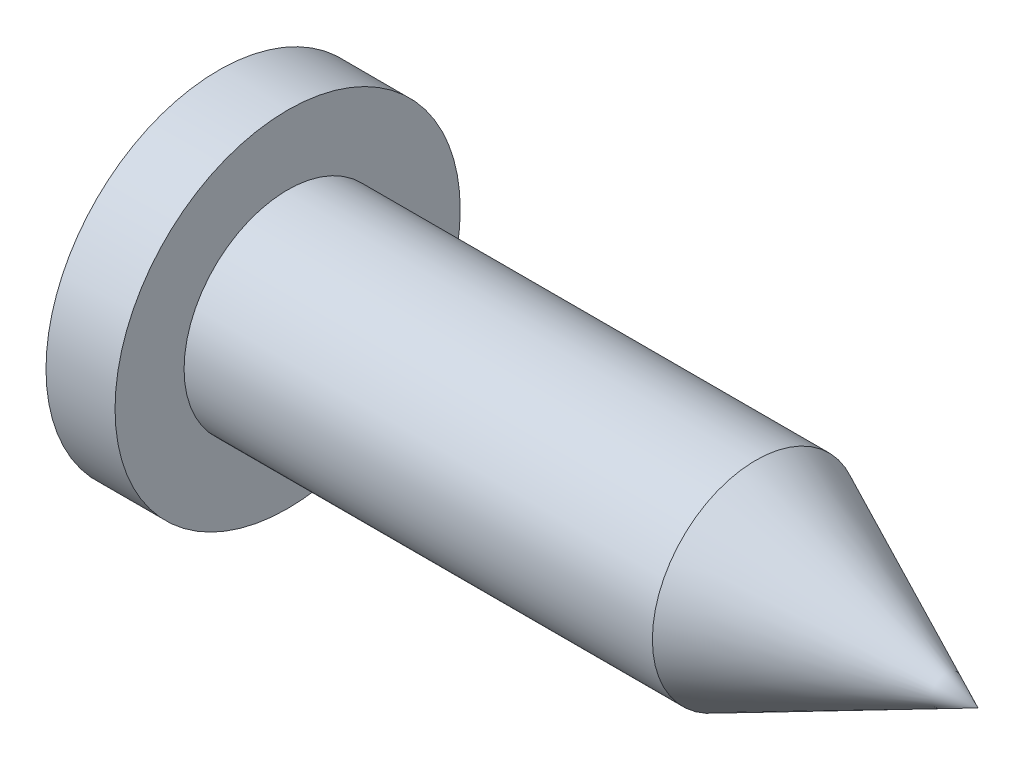
ISO-10303-21;
HEADER;
FILE_DESCRIPTION(('STEP AP214'),'2;1');
FILE_NAME('part.step','',(''),(''),'','','');
FILE_SCHEMA(('AUTOMOTIVE_DESIGN { 1 0 10303 214 1 1 1 1 }'));
ENDSEC;
DATA;
#1=APPLICATION_CONTEXT('core data for automotive mechanical design processes');
#2=APPLICATION_PROTOCOL_DEFINITION('international standard','automotive_design',2000,#1);
#3=PRODUCT_CONTEXT('',#1,'mechanical');
#4=PRODUCT('Part','Part','',(#3));
#5=PRODUCT_RELATED_PRODUCT_CATEGORY('part','',(#4));
#6=PRODUCT_DEFINITION_FORMATION('','',#4);
#7=PRODUCT_DEFINITION_CONTEXT('part definition',#1,'design');
#8=PRODUCT_DEFINITION('design','',#6,#7);
#9=PRODUCT_DEFINITION_SHAPE('','',#8);
#10=(LENGTH_UNIT() NAMED_UNIT(*) SI_UNIT(.MILLI.,.METRE.));
#11=(NAMED_UNIT(*) PLANE_ANGLE_UNIT() SI_UNIT($,.RADIAN.));
#12=(NAMED_UNIT(*) SI_UNIT($,.STERADIAN.) SOLID_ANGLE_UNIT());
#13=UNCERTAINTY_MEASURE_WITH_UNIT(LENGTH_MEASURE(1.E-05),#10,'distance_accuracy_value','');
#14=(GEOMETRIC_REPRESENTATION_CONTEXT(3) GLOBAL_UNCERTAINTY_ASSIGNED_CONTEXT((#13)) GLOBAL_UNIT_ASSIGNED_CONTEXT((#10,
#11,#12)) REPRESENTATION_CONTEXT('',''));
#15=CARTESIAN_POINT('',(0.,0.,0.));
#16=DIRECTION('',(0.,0.,1.));
#17=DIRECTION('',(1.,0.,0.));
#18=AXIS2_PLACEMENT_3D('',#15,#16,#17);
#19=CARTESIAN_POINT('',(6.5,0.,0.));
#20=DIRECTION('',(-1.,0.,0.));
#21=DIRECTION('',(0.,1.,0.));
#22=AXIS2_PLACEMENT_3D('',#19,#20,#21);
#23=SPHERICAL_SURFACE('',#22,6.49999999999999);
#24=CARTESIAN_POINT('',(0.5,0.,0.));
#25=DIRECTION('',(-1.,0.,0.));
#26=DIRECTION('',(0.,0.,1.));
#27=AXIS2_PLACEMENT_3D('',#24,#25,#26);
#28=CIRCLE('',#27,2.5);
#29=CARTESIAN_POINT('',(0.5,0.,2.5));
#30=VERTEX_POINT('',#29);
#31=EDGE_CURVE('E167',#30,#30,#28,.T.);
#32=ORIENTED_EDGE('',*,*,#31,.T.);
#33=EDGE_LOOP('',(#32));
#34=FACE_BOUND('',#33,.T.);
#35=CARTESIAN_POINT('',(6.5,0.,-1.5));
#36=DIRECTION('',(0.,0.,1.));
#37=DIRECTION('',(1.,0.,0.));
#38=AXIS2_PLACEMENT_3D('',#35,#36,#37);
#39=CIRCLE('',#38,6.32455532033675);
#40=CARTESIAN_POINT('',(0.180387670117737,0.25,-1.5));
#41=VERTEX_POINT('',#40);
#42=CARTESIAN_POINT('',(0.180387670117737,-0.25,-1.5));
#43=VERTEX_POINT('',#42);
#44=EDGE_CURVE('E11',#41,#43,#39,.T.);
#45=ORIENTED_EDGE('',*,*,#44,.F.);
#46=CARTESIAN_POINT('',(6.5,0.249999999999997,0.));
#47=DIRECTION('',(0.,-1.,0.));
#48=DIRECTION('',(0.,0.,-1.));
#49=AXIS2_PLACEMENT_3D('',#46,#47,#48);
#50=CIRCLE('',#49,6.49519052838328);
#51=CARTESIAN_POINT('',(0.0902418142335562,0.249999999999999,-1.05));
#52=VERTEX_POINT('',#51);
#53=EDGE_CURVE('E43',#52,#41,#50,.T.);
#54=ORIENTED_EDGE('',*,*,#53,.F.);
#55=CARTESIAN_POINT('',(0.0902745809590301,1.0502,-0.250000025000002));
#56=CARTESIAN_POINT('',(0.0830338669290962,1.00604908079703,-0.249949134500271));
#57=CARTESIAN_POINT('',(0.0763993470101838,0.961792303791953,-0.253631242364246));
#58=CARTESIAN_POINT('',(0.0645060143461181,0.87431572902394,-0.268280980611941));
#59=CARTESIAN_POINT('',(0.059247107306933,0.831095860368686,-0.279248111447245));
#60=CARTESIAN_POINT('',(0.0502625862570329,0.746891394013683,-0.308302648381681));
#61=CARTESIAN_POINT('',(0.0465385815011688,0.705909181207701,-0.326397488802618));
#62=CARTESIAN_POINT('',(0.0407457011740062,0.627464864365726,-0.369221990256885));
#63=CARTESIAN_POINT('',(0.0386760810631147,0.590001183555728,-0.393948660001514));
#64=CARTESIAN_POINT('',(0.0362713753292827,0.520187541532627,-0.448961839913504));
#65=CARTESIAN_POINT('',(0.0359126271832219,0.487773853672262,-0.479166468285128));
#66=CARTESIAN_POINT('',(0.0368764740257376,0.428377186371185,-0.544496391248316));
#67=CARTESIAN_POINT('',(0.0381992564104099,0.401394812604775,-0.579622233890337));
#68=CARTESIAN_POINT('',(0.0424715984055113,0.353775740128562,-0.653524937016202));
#69=CARTESIAN_POINT('',(0.0454107014259982,0.333099567025498,-0.692277014596924));
#70=CARTESIAN_POINT('',(0.0528218717636641,0.298394584888586,-0.77251390597186));
#71=CARTESIAN_POINT('',(0.0572936535239028,0.284364538758437,-0.813998209556437));
#72=CARTESIAN_POINT('',(0.0663564665811021,0.265877909840366,-0.888048736093779));
#73=CARTESIAN_POINT('',(0.0706449447752412,0.259912323696939,-0.920285419108512));
#74=CARTESIAN_POINT('',(0.0799388849229895,0.251968022745253,-0.985097111260076));
#75=CARTESIAN_POINT('',(0.0849433124252143,0.249983616759219,-1.0176715704365));
#76=CARTESIAN_POINT('',(0.0902745809590314,0.250000025,-1.0502));
#77=B_SPLINE_CURVE_WITH_KNOTS('',3,(#55,#56,#57,#58,#59,#60,#61,#62,#63,#64,#65,#66,#67,#68,#69,
#70,#71,#72,#73,#74,#75,#76),.UNSPECIFIED.,.F.,.F.,(4,2,2,2,2,2,2,2,2,2,4),(0.,
0.134074287006733,0.268139381223696,0.402344679444162,0.536489545828248,0.668773608805178,
0.80107241530883,0.932525231066524,1.06395356884563,1.16290333171457,1.26171154281285),.UNSPECIFIED.);
#78=CARTESIAN_POINT('',(0.0902418142335569,1.05,-0.250000000000001));
#79=VERTEX_POINT('',#78);
#80=EDGE_CURVE('E273',#79,#52,#77,.T.);
#81=ORIENTED_EDGE('',*,*,#80,.F.);
#82=CARTESIAN_POINT('',(6.5,0.,-0.250000000000006));
#83=DIRECTION('',(0.,0.,1.));
#84=DIRECTION('',(0.,-1.,0.));
#85=AXIS2_PLACEMENT_3D('',#82,#83,#84);
#86=CIRCLE('',#85,6.49519052838328);
#87=CARTESIAN_POINT('',(0.180387670117737,1.5,-0.249999999999999));
#88=VERTEX_POINT('',#87);
#89=EDGE_CURVE('E279',#88,#79,#86,.T.);
#90=ORIENTED_EDGE('',*,*,#89,.F.);
#91=CARTESIAN_POINT('',(6.5,1.5,0.));
#92=DIRECTION('',(0.,-1.,0.));
#93=DIRECTION('',(0.,0.,-1.));
#94=AXIS2_PLACEMENT_3D('',#91,#92,#93);
#95=CIRCLE('',#94,6.32455532033675);
#96=CARTESIAN_POINT('',(0.180387670117737,1.5,0.250000000000001));
#97=VERTEX_POINT('',#96);
#98=EDGE_CURVE('E280',#97,#88,#95,.T.);
#99=ORIENTED_EDGE('',*,*,#98,.F.);
#100=CARTESIAN_POINT('',(6.5,0.,0.25));
#101=DIRECTION('',(0.,0.,-1.));
#102=DIRECTION('',(0.,1.,0.));
#103=AXIS2_PLACEMENT_3D('',#100,#101,#102);
#104=CIRCLE('',#103,6.49519052838328);
#105=CARTESIAN_POINT('',(0.0902418142335555,1.05,0.25));
#106=VERTEX_POINT('',#105);
#107=EDGE_CURVE('E245',#106,#97,#104,.T.);
#108=ORIENTED_EDGE('',*,*,#107,.F.);
#109=CARTESIAN_POINT('',(0.0902745809590307,0.250000024999999,1.0502));
#110=CARTESIAN_POINT('',(0.0830338669290944,0.249949134500269,1.00604908079703));
#111=CARTESIAN_POINT('',(0.0763993470101822,0.253631242364244,0.961792303791954));
#112=CARTESIAN_POINT('',(0.064506014346118,0.268280980611939,0.87431572902394));
#113=CARTESIAN_POINT('',(0.0592471073069343,0.279248111447242,0.831095860368686));
#114=CARTESIAN_POINT('',(0.0502625862570343,0.308302648381679,0.746891394013684));
#115=CARTESIAN_POINT('',(0.0465385815011689,0.326397488802616,0.705909181207702));
#116=CARTESIAN_POINT('',(0.040745701174005,0.369221990256883,0.627464864365727));
#117=CARTESIAN_POINT('',(0.0386760810631136,0.393948660001512,0.590001183555729));
#118=CARTESIAN_POINT('',(0.0362713753292829,0.448961839913502,0.520187541532628));
#119=CARTESIAN_POINT('',(0.0359126271832233,0.479166468285126,0.487773853672263));
#120=CARTESIAN_POINT('',(0.0368764740257394,0.544496391248314,0.428377186371185));
#121=CARTESIAN_POINT('',(0.0381992564104108,0.579622233890335,0.401394812604775));
#122=CARTESIAN_POINT('',(0.0424715984055112,0.6535249370162,0.353775740128563));
#123=CARTESIAN_POINT('',(0.0454107014259977,0.692277014596923,0.333099567025499));
#124=CARTESIAN_POINT('',(0.052821871763664,0.772513905971858,0.298394584888587));
#125=CARTESIAN_POINT('',(0.0572936535239034,0.813998209556435,0.284364538758438));
#126=CARTESIAN_POINT('',(0.0663564665811023,0.888048736093777,0.265877909840367));
#127=CARTESIAN_POINT('',(0.0706449447752407,0.920285419108511,0.25991232369694));
#128=CARTESIAN_POINT('',(0.079938884922988,0.985097111260074,0.251968022745254));
#129=CARTESIAN_POINT('',(0.0849433124252126,1.0176715704365,0.249983616759221));
#130=CARTESIAN_POINT('',(0.0902745809590307,1.0502,0.250000025000001));
#131=B_SPLINE_CURVE_WITH_KNOTS('',3,(#109,#110,#111,#112,#113,#114,#115,#116,#117,#118,#119,
#120,#121,#122,#123,#124,#125,#126,#127,#128,#129,#130),.UNSPECIFIED.,.F.,.F.,(4,2,2,2,2,2,2,2,
2,2,4),(0.,0.134074287006733,0.268139381223697,0.402344679444162,0.536489545828248,
0.668773608805179,0.801072415308831,0.932525231066525,1.06395356884563,1.16290333171457,
1.26171154281285),.UNSPECIFIED.);
#132=CARTESIAN_POINT('',(0.0902418142335569,0.249999999999999,1.05));
#133=VERTEX_POINT('',#132);
#134=EDGE_CURVE('E238',#133,#106,#131,.T.);
#135=ORIENTED_EDGE('',*,*,#134,.F.);
#136=CARTESIAN_POINT('',(6.5,0.25,0.));
#137=DIRECTION('',(0.,-1.,0.));
#138=DIRECTION('',(0.,0.,-1.));
#139=AXIS2_PLACEMENT_3D('',#136,#137,#138);
#140=CIRCLE('',#139,6.49519052838328);
#141=CARTESIAN_POINT('',(0.180387670117737,0.249999999999999,1.5));
#142=VERTEX_POINT('',#141);
#143=EDGE_CURVE('E236',#142,#133,#140,.T.);
#144=ORIENTED_EDGE('',*,*,#143,.F.);
#145=CARTESIAN_POINT('',(6.5,0.,1.5));
#146=DIRECTION('',(0.,0.,-1.));
#147=DIRECTION('',(-1.,0.,0.));
#148=AXIS2_PLACEMENT_3D('',#145,#146,#147);
#149=CIRCLE('',#148,6.32455532033675);
#150=CARTESIAN_POINT('',(0.180387670117737,-0.250000000000001,1.5));
#151=VERTEX_POINT('',#150);
#152=EDGE_CURVE('E234',#151,#142,#149,.T.);
#153=ORIENTED_EDGE('',*,*,#152,.F.);
#154=CARTESIAN_POINT('',(6.5,-0.250000000000001,0.));
#155=DIRECTION('',(0.,1.,0.));
#156=DIRECTION('',(0.,0.,1.));
#157=AXIS2_PLACEMENT_3D('',#154,#155,#156);
#158=CIRCLE('',#157,6.49519052838328);
#159=CARTESIAN_POINT('',(0.0902418142335564,-0.250000000000001,1.05));
#160=VERTEX_POINT('',#159);
#161=EDGE_CURVE('E231',#160,#151,#158,.T.);
#162=ORIENTED_EDGE('',*,*,#161,.F.);
#163=CARTESIAN_POINT('',(0.0902745809590307,-1.0502,0.250000025000001));
#164=CARTESIAN_POINT('',(0.0830338669290944,-1.00604908079703,0.24994913450027));
#165=CARTESIAN_POINT('',(0.0763993470101822,-0.961792303791954,0.253631242364245));
#166=CARTESIAN_POINT('',(0.064506014346118,-0.874315729023941,0.26828098061194));
#167=CARTESIAN_POINT('',(0.0592471073069343,-0.831095860368687,0.279248111447244));
#168=CARTESIAN_POINT('',(0.0502625862570343,-0.746891394013684,0.30830264838168));
#169=CARTESIAN_POINT('',(0.0465385815011688,-0.705909181207703,0.326397488802617));
#170=CARTESIAN_POINT('',(0.040745701174005,-0.627464864365727,0.369221990256884));
#171=CARTESIAN_POINT('',(0.0386760810631136,-0.590001183555729,0.393948660001513));
#172=CARTESIAN_POINT('',(0.0362713753292829,-0.520187541532629,0.448961839913503));
#173=CARTESIAN_POINT('',(0.0359126271832233,-0.487773853672263,0.479166468285127));
#174=CARTESIAN_POINT('',(0.0368764740257394,-0.428377186371186,0.544496391248315));
#175=CARTESIAN_POINT('',(0.0381992564104108,-0.401394812604776,0.579622233890336));
#176=CARTESIAN_POINT('',(0.0424715984055112,-0.353775740128563,0.653524937016201));
#177=CARTESIAN_POINT('',(0.0454107014259977,-0.3330995670255,0.692277014596924));
#178=CARTESIAN_POINT('',(0.052821871763664,-0.298394584888587,0.772513905971859));
#179=CARTESIAN_POINT('',(0.0572936535239034,-0.284364538758438,0.813998209556436));
#180=CARTESIAN_POINT('',(0.0663564665811023,-0.265877909840368,0.888048736093779));
#181=CARTESIAN_POINT('',(0.0706449447752407,-0.25991232369694,0.920285419108512));
#182=CARTESIAN_POINT('',(0.0799388849229881,-0.251968022745254,0.985097111260076));
#183=CARTESIAN_POINT('',(0.0849433124252127,-0.249983616759221,1.0176715704365));
#184=CARTESIAN_POINT('',(0.0902745809590307,-0.250000025000001,1.0502));
#185=B_SPLINE_CURVE_WITH_KNOTS('',3,(#163,#164,#165,#166,#167,#168,#169,#170,#171,#172,#173,
#174,#175,#176,#177,#178,#179,#180,#181,#182,#183,#184),.UNSPECIFIED.,.F.,.F.,(4,2,2,2,2,2,2,2,
2,2,4),(0.,0.134074287006733,0.268139381223697,0.402344679444162,0.536489545828248,
0.668773608805179,0.801072415308831,0.932525231066525,1.06395356884563,1.16290333171457,
1.26171154281285),.UNSPECIFIED.);
#186=CARTESIAN_POINT('',(0.0902418142335569,-1.05,0.25));
#187=VERTEX_POINT('',#186);
#188=EDGE_CURVE('E224',#187,#160,#185,.T.);
#189=ORIENTED_EDGE('',*,*,#188,.F.);
#190=CARTESIAN_POINT('',(6.5,0.,0.25));
#191=DIRECTION('',(0.,0.,-1.));
#192=DIRECTION('',(0.,1.,0.));
#193=AXIS2_PLACEMENT_3D('',#190,#191,#192);
#194=CIRCLE('',#193,6.49519052838328);
#195=CARTESIAN_POINT('',(0.180387670117737,-1.5,0.25));
#196=VERTEX_POINT('',#195);
#197=EDGE_CURVE('E232',#196,#187,#194,.T.);
#198=ORIENTED_EDGE('',*,*,#197,.F.);
#199=CARTESIAN_POINT('',(6.5,-1.5,0.));
#200=DIRECTION('',(0.,1.,0.));
#201=DIRECTION('',(0.,0.,1.));
#202=AXIS2_PLACEMENT_3D('',#199,#200,#201);
#203=CIRCLE('',#202,6.32455532033675);
#204=CARTESIAN_POINT('',(0.180387670117737,-1.5,-0.250000000000002));
#205=VERTEX_POINT('',#204);
#206=EDGE_CURVE('E380',#205,#196,#203,.T.);
#207=ORIENTED_EDGE('',*,*,#206,.F.);
#208=CARTESIAN_POINT('',(6.5,0.,-0.250000000000001));
#209=DIRECTION('',(0.,0.,1.));
#210=DIRECTION('',(0.,-1.,0.));
#211=AXIS2_PLACEMENT_3D('',#208,#209,#210);
#212=CIRCLE('',#211,6.49519052838328);
#213=CARTESIAN_POINT('',(0.0902418142335562,-1.05,-0.250000000000002));
#214=VERTEX_POINT('',#213);
#215=EDGE_CURVE('E194',#214,#205,#212,.T.);
#216=ORIENTED_EDGE('',*,*,#215,.F.);
#217=CARTESIAN_POINT('',(0.0902745809590306,-0.250000025000001,-1.0502));
#218=CARTESIAN_POINT('',(0.0830338669290947,-0.24994913450027,-1.00604908079703));
#219=CARTESIAN_POINT('',(0.0763993470101823,-0.253631242364245,-0.961792303791955));
#220=CARTESIAN_POINT('',(0.0645060143461178,-0.26828098061194,-0.874315729023942));
#221=CARTESIAN_POINT('',(0.059247107306934,-0.279248111447244,-0.831095860368688));
#222=CARTESIAN_POINT('',(0.0502625862570344,-0.30830264838168,-0.746891394013685));
#223=CARTESIAN_POINT('',(0.0465385815011696,-0.326397488802617,-0.705909181207704));
#224=CARTESIAN_POINT('',(0.0407457011740058,-0.369221990256884,-0.627464864365729));
#225=CARTESIAN_POINT('',(0.0386760810631138,-0.393948660001513,-0.59000118355573));
#226=CARTESIAN_POINT('',(0.0362713753292825,-0.448961839913503,-0.52018754153263));
#227=CARTESIAN_POINT('',(0.0359126271832231,-0.479166468285127,-0.487773853672264));
#228=CARTESIAN_POINT('',(0.0368764740257393,-0.544496391248315,-0.428377186371187));
#229=CARTESIAN_POINT('',(0.0381992564104106,-0.579622233890336,-0.401394812604777));
#230=CARTESIAN_POINT('',(0.042471598405511,-0.653524937016201,-0.353775740128564));
#231=CARTESIAN_POINT('',(0.0454107014259977,-0.692277014596924,-0.333099567025501));
#232=CARTESIAN_POINT('',(0.0528218717636637,-0.772513905971859,-0.298394584888588));
#233=CARTESIAN_POINT('',(0.0572936535239026,-0.813998209556436,-0.28436453875844));
#234=CARTESIAN_POINT('',(0.0663564665811025,-0.888048736093778,-0.265877909840369));
#235=CARTESIAN_POINT('',(0.0706449447752419,-0.920285419108512,-0.259912323696942));
#236=CARTESIAN_POINT('',(0.07993888492299,-0.985097111260075,-0.251968022745255));
#237=CARTESIAN_POINT('',(0.0849433124252145,-1.0176715704365,-0.249983616759222));
#238=CARTESIAN_POINT('',(0.0902745809590306,-1.0502,-0.250000025000002));
#239=B_SPLINE_CURVE_WITH_KNOTS('',3,(#217,#218,#219,#220,#221,#222,#223,#224,#225,#226,#227,
#228,#229,#230,#231,#232,#233,#234,#235,#236,#237,#238),.UNSPECIFIED.,.F.,.F.,(4,2,2,2,2,2,2,2,
2,2,4),(0.,0.134074287006733,0.268139381223697,0.402344679444162,0.536489545828248,
0.668773608805179,0.80107241530883,0.932525231066524,1.06395356884563,1.16290333171457,
1.26171154281285),.UNSPECIFIED.);
#240=CARTESIAN_POINT('',(0.0902418142335578,-0.25,-1.05));
#241=VERTEX_POINT('',#240);
#242=EDGE_CURVE('E187',#241,#214,#239,.T.);
#243=ORIENTED_EDGE('',*,*,#242,.F.);
#244=CARTESIAN_POINT('',(6.5,-0.250000000000002,0.));
#245=DIRECTION('',(0.,1.,0.));
#246=DIRECTION('',(0.,0.,1.));
#247=AXIS2_PLACEMENT_3D('',#244,#245,#246);
#248=CIRCLE('',#247,6.49519052838328);
#249=EDGE_CURVE('E185',#43,#241,#248,.T.);
#250=ORIENTED_EDGE('',*,*,#249,.F.);
#251=EDGE_LOOP('',(#45,#54,#81,#90,#99,#108,#135,#144,#153,#162,#189,#198,#207,#216,#243,#250));
#252=FACE_BOUND('',#251,.T.);
#253=ADVANCED_FACE('F35',(#34,#252),#23,.T.);
#254=CARTESIAN_POINT('',(11.5,0.,0.));
#255=DIRECTION('',(-1.,0.,0.));
#256=DIRECTION('',(0.,0.,1.));
#257=AXIS2_PLACEMENT_3D('',#254,#255,#256);
#258=CONICAL_SURFACE('',#257,0.,0.436332312998575);
#259=CARTESIAN_POINT('',(8.28323961923561,0.,0.));
#260=DIRECTION('',(-1.,0.,0.));
#261=DIRECTION('',(0.,0.,1.));
#262=AXIS2_PLACEMENT_3D('',#259,#260,#261);
#263=CIRCLE('',#262,1.5);
#264=CARTESIAN_POINT('',(8.28323961923561,0.,1.5));
#265=VERTEX_POINT('',#264);
#266=EDGE_CURVE('E182',#265,#265,#263,.T.);
#267=ORIENTED_EDGE('',*,*,#266,.F.);
#268=EDGE_LOOP('',(#267));
#269=FACE_BOUND('',#268,.T.);
#270=CARTESIAN_POINT('',(11.5,0.,0.));
#271=VERTEX_POINT('',#270);
#272=VERTEX_LOOP('',#271);
#273=FACE_BOUND('',#272,.T.);
#274=ADVANCED_FACE('F395',(#269,#273),#258,.T.);
#275=CARTESIAN_POINT('',(-93.8525096525096,0.,0.));
#276=DIRECTION('',(-1.,0.,0.));
#277=DIRECTION('',(0.,0.,1.));
#278=AXIS2_PLACEMENT_3D('',#275,#276,#277);
#279=CYLINDRICAL_SURFACE('',#278,1.5);
#280=CARTESIAN_POINT('',(1.5,0.,0.));
#281=DIRECTION('',(-1.,0.,0.));
#282=DIRECTION('',(0.,0.,1.));
#283=AXIS2_PLACEMENT_3D('',#280,#281,#282);
#284=CIRCLE('',#283,1.5);
#285=CARTESIAN_POINT('',(1.5,0.,1.5));
#286=VERTEX_POINT('',#285);
#287=EDGE_CURVE('E179',#286,#286,#284,.T.);
#288=ORIENTED_EDGE('',*,*,#287,.F.);
#289=EDGE_LOOP('',(#288));
#290=FACE_BOUND('',#289,.T.);
#291=ORIENTED_EDGE('',*,*,#266,.T.);
#292=EDGE_LOOP('',(#291));
#293=FACE_BOUND('',#292,.T.);
#294=ADVANCED_FACE('F400',(#290,#293),#279,.T.);
#295=CARTESIAN_POINT('',(1.5,2.5,0.));
#296=DIRECTION('',(-1.,0.,0.));
#297=DIRECTION('',(0.,0.,1.));
#298=AXIS2_PLACEMENT_3D('',#295,#296,#297);
#299=PLANE('',#298);
#300=CARTESIAN_POINT('',(1.5,0.,0.));
#301=DIRECTION('',(-1.,0.,0.));
#302=DIRECTION('',(0.,0.,1.));
#303=AXIS2_PLACEMENT_3D('',#300,#301,#302);
#304=CIRCLE('',#303,2.5);
#305=CARTESIAN_POINT('',(1.5,0.,2.5));
#306=VERTEX_POINT('',#305);
#307=EDGE_CURVE('E171',#306,#306,#304,.T.);
#308=ORIENTED_EDGE('',*,*,#307,.F.);
#309=EDGE_LOOP('',(#308));
#310=FACE_BOUND('',#309,.T.);
#311=ORIENTED_EDGE('',*,*,#287,.T.);
#312=EDGE_LOOP('',(#311));
#313=FACE_BOUND('',#312,.T.);
#314=ADVANCED_FACE('F407',(#310,#313),#299,.F.);
#315=CARTESIAN_POINT('',(-93.8525096525096,0.,0.));
#316=DIRECTION('',(-1.,0.,0.));
#317=DIRECTION('',(0.,0.,1.));
#318=AXIS2_PLACEMENT_3D('',#315,#316,#317);
#319=CYLINDRICAL_SURFACE('',#318,2.5);
#320=ORIENTED_EDGE('',*,*,#31,.F.);
#321=EDGE_LOOP('',(#320));
#322=FACE_BOUND('',#321,.T.);
#323=ORIENTED_EDGE('',*,*,#307,.T.);
#324=EDGE_LOOP('',(#323));
#325=FACE_BOUND('',#324,.T.);
#326=ADVANCED_FACE('F404',(#322,#325),#319,.T.);
#327=CARTESIAN_POINT('',(0.5,0.25,-1.5));
#328=DIRECTION('',(0.,0.,1.));
#329=DIRECTION('',(1.,0.,0.));
#330=AXIS2_PLACEMENT_3D('',#327,#328,#329);
#331=PLANE('',#330);
#332=ORIENTED_EDGE('',*,*,#44,.T.);
#333=DIRECTION('',(-1.,0.,0.));
#334=VECTOR('',#333,1.);
#335=CARTESIAN_POINT('',(0.5,-0.25,-1.5));
#336=LINE('',#335,#334);
#337=CARTESIAN_POINT('',(0.5,-0.25,-1.5));
#338=VERTEX_POINT('',#337);
#339=EDGE_CURVE('E50',#338,#43,#336,.T.);
#340=ORIENTED_EDGE('',*,*,#339,.F.);
#341=DIRECTION('',(0.,1.,0.));
#342=VECTOR('',#341,1.);
#343=CARTESIAN_POINT('',(0.5,0.25,-1.5));
#344=LINE('',#343,#342);
#345=CARTESIAN_POINT('',(0.5,0.25,-1.5));
#346=VERTEX_POINT('',#345);
#347=EDGE_CURVE('E151',#338,#346,#344,.T.);
#348=ORIENTED_EDGE('',*,*,#347,.T.);
#349=DIRECTION('',(-1.,0.,0.));
#350=VECTOR('',#349,1.);
#351=CARTESIAN_POINT('',(0.5,0.25,-1.5));
#352=LINE('',#351,#350);
#353=EDGE_CURVE('E162',#346,#41,#352,.T.);
#354=ORIENTED_EDGE('',*,*,#353,.T.);
#355=EDGE_LOOP('',(#332,#340,#348,#354));
#356=FACE_BOUND('',#355,.T.);
#357=ADVANCED_FACE('F161',(#356),#331,.T.);
#358=CARTESIAN_POINT('',(0.5,0.25,-1.5));
#359=DIRECTION('',(0.,-1.,0.));
#360=DIRECTION('',(0.,0.,-1.));
#361=AXIS2_PLACEMENT_3D('',#358,#359,#360);
#362=PLANE('',#361);
#363=ORIENTED_EDGE('',*,*,#53,.T.);
#364=ORIENTED_EDGE('',*,*,#353,.F.);
#365=DIRECTION('',(0.,0.,1.));
#366=VECTOR('',#365,1.);
#367=CARTESIAN_POINT('',(0.5,0.25,-1.5));
#368=LINE('',#367,#366);
#369=CARTESIAN_POINT('',(0.5,0.249999999999999,-1.05));
#370=VERTEX_POINT('',#369);
#371=EDGE_CURVE('E147',#346,#370,#368,.T.);
#372=ORIENTED_EDGE('',*,*,#371,.T.);
#373=DIRECTION('',(-1.,0.,0.));
#374=VECTOR('',#373,1.);
#375=CARTESIAN_POINT('',(0.5,0.249999999999999,-1.05));
#376=LINE('',#375,#374);
#377=EDGE_CURVE('E168',#370,#52,#376,.T.);
#378=ORIENTED_EDGE('',*,*,#377,.T.);
#379=EDGE_LOOP('',(#363,#364,#372,#378));
#380=FACE_BOUND('',#379,.T.);
#381=ADVANCED_FACE('F165',(#380),#362,.T.);
#382=CARTESIAN_POINT('',(0.5,1.05,-1.05));
#383=DIRECTION('',(-1.,0.,0.));
#384=DIRECTION('',(0.,0.,1.));
#385=AXIS2_PLACEMENT_3D('',#382,#383,#384);
#386=CYLINDRICAL_SURFACE('',#385,0.8);
#387=ORIENTED_EDGE('',*,*,#80,.T.);
#388=ORIENTED_EDGE('',*,*,#377,.F.);
#389=CARTESIAN_POINT('',(0.5,1.05,-1.05));
#390=DIRECTION('',(-1.,0.,0.));
#391=DIRECTION('',(0.,0.,1.));
#392=AXIS2_PLACEMENT_3D('',#389,#390,#391);
#393=CIRCLE('',#392,0.8);
#394=CARTESIAN_POINT('',(0.5,1.05,-0.250000000000001));
#395=VERTEX_POINT('',#394);
#396=EDGE_CURVE('E153',#370,#395,#393,.T.);
#397=ORIENTED_EDGE('',*,*,#396,.T.);
#398=DIRECTION('',(-1.,0.,0.));
#399=VECTOR('',#398,1.);
#400=CARTESIAN_POINT('',(0.5,1.05,-0.250000000000001));
#401=LINE('',#400,#399);
#402=EDGE_CURVE('E173',#395,#79,#401,.T.);
#403=ORIENTED_EDGE('',*,*,#402,.T.);
#404=EDGE_LOOP('',(#387,#388,#397,#403));
#405=FACE_BOUND('',#404,.T.);
#406=ADVANCED_FACE('F265',(#405),#386,.T.);
#407=CARTESIAN_POINT('',(0.5,1.5,-0.249999999999999));
#408=DIRECTION('',(0.,0.,1.));
#409=DIRECTION('',(0.,-1.,0.));
#410=AXIS2_PLACEMENT_3D('',#407,#408,#409);
#411=PLANE('',#410);
#412=ORIENTED_EDGE('',*,*,#89,.T.);
#413=ORIENTED_EDGE('',*,*,#402,.F.);
#414=DIRECTION('',(0.,1.,0.));
#415=VECTOR('',#414,1.);
#416=CARTESIAN_POINT('',(0.5,1.5,-0.249999999999999));
#417=LINE('',#416,#415);
#418=CARTESIAN_POINT('',(0.5,1.5,-0.249999999999999));
#419=VERTEX_POINT('',#418);
#420=EDGE_CURVE('E356',#395,#419,#417,.T.);
#421=ORIENTED_EDGE('',*,*,#420,.T.);
#422=DIRECTION('',(-1.,0.,0.));
#423=VECTOR('',#422,1.);
#424=CARTESIAN_POINT('',(0.5,1.5,-0.249999999999999));
#425=LINE('',#424,#423);
#426=EDGE_CURVE('E296',#419,#88,#425,.T.);
#427=ORIENTED_EDGE('',*,*,#426,.T.);
#428=EDGE_LOOP('',(#412,#413,#421,#427));
#429=FACE_BOUND('',#428,.T.);
#430=ADVANCED_FACE('F261',(#429),#411,.T.);
#431=CARTESIAN_POINT('',(0.5,1.5,-0.249999999999999));
#432=DIRECTION('',(0.,-1.,0.));
#433=DIRECTION('',(0.,0.,-1.));
#434=AXIS2_PLACEMENT_3D('',#431,#432,#433);
#435=PLANE('',#434);
#436=ORIENTED_EDGE('',*,*,#98,.T.);
#437=ORIENTED_EDGE('',*,*,#426,.F.);
#438=DIRECTION('',(0.,0.,1.));
#439=VECTOR('',#438,1.);
#440=CARTESIAN_POINT('',(0.5,1.5,-0.249999999999999));
#441=LINE('',#440,#439);
#442=CARTESIAN_POINT('',(0.5,1.5,0.250000000000001));
#443=VERTEX_POINT('',#442);
#444=EDGE_CURVE('E295',#419,#443,#441,.T.);
#445=ORIENTED_EDGE('',*,*,#444,.T.);
#446=DIRECTION('',(-1.,0.,0.));
#447=VECTOR('',#446,1.);
#448=CARTESIAN_POINT('',(0.5,1.5,0.250000000000001));
#449=LINE('',#448,#447);
#450=EDGE_CURVE('E288',#443,#97,#449,.T.);
#451=ORIENTED_EDGE('',*,*,#450,.T.);
#452=EDGE_LOOP('',(#436,#437,#445,#451));
#453=FACE_BOUND('',#452,.T.);
#454=ADVANCED_FACE('F257',(#453),#435,.T.);
#455=CARTESIAN_POINT('',(0.5,1.5,0.250000000000001));
#456=DIRECTION('',(0.,0.,-1.));
#457=DIRECTION('',(0.,1.,0.));
#458=AXIS2_PLACEMENT_3D('',#455,#456,#457);
#459=PLANE('',#458);
#460=ORIENTED_EDGE('',*,*,#107,.T.);
#461=ORIENTED_EDGE('',*,*,#450,.F.);
#462=DIRECTION('',(0.,-1.,0.));
#463=VECTOR('',#462,1.);
#464=CARTESIAN_POINT('',(0.5,1.5,0.250000000000001));
#465=LINE('',#464,#463);
#466=CARTESIAN_POINT('',(0.5,1.05,0.25));
#467=VERTEX_POINT('',#466);
#468=EDGE_CURVE('E353',#443,#467,#465,.T.);
#469=ORIENTED_EDGE('',*,*,#468,.T.);
#470=DIRECTION('',(-1.,0.,0.));
#471=VECTOR('',#470,1.);
#472=CARTESIAN_POINT('',(0.5,1.05,0.25));
#473=LINE('',#472,#471);
#474=EDGE_CURVE('E291',#467,#106,#473,.T.);
#475=ORIENTED_EDGE('',*,*,#474,.T.);
#476=EDGE_LOOP('',(#460,#461,#469,#475));
#477=FACE_BOUND('',#476,.T.);
#478=ADVANCED_FACE('F253',(#477),#459,.T.);
#479=CARTESIAN_POINT('',(0.5,1.05,1.05));
#480=DIRECTION('',(-1.,0.,0.));
#481=DIRECTION('',(0.,0.,1.));
#482=AXIS2_PLACEMENT_3D('',#479,#480,#481);
#483=CYLINDRICAL_SURFACE('',#482,0.8);
#484=ORIENTED_EDGE('',*,*,#134,.T.);
#485=ORIENTED_EDGE('',*,*,#474,.F.);
#486=CARTESIAN_POINT('',(0.5,1.05,1.05));
#487=DIRECTION('',(-1.,0.,0.));
#488=DIRECTION('',(0.,0.,1.));
#489=AXIS2_PLACEMENT_3D('',#486,#487,#488);
#490=CIRCLE('',#489,0.8);
#491=CARTESIAN_POINT('',(0.5,0.249999999999999,1.05));
#492=VERTEX_POINT('',#491);
#493=EDGE_CURVE('E351',#467,#492,#490,.T.);
#494=ORIENTED_EDGE('',*,*,#493,.T.);
#495=DIRECTION('',(-1.,0.,0.));
#496=VECTOR('',#495,1.);
#497=CARTESIAN_POINT('',(0.5,0.249999999999999,1.05));
#498=LINE('',#497,#496);
#499=EDGE_CURVE('E305',#492,#133,#498,.T.);
#500=ORIENTED_EDGE('',*,*,#499,.T.);
#501=EDGE_LOOP('',(#484,#485,#494,#500));
#502=FACE_BOUND('',#501,.T.);
#503=ADVANCED_FACE('F247',(#502),#483,.T.);
#504=CARTESIAN_POINT('',(0.5,0.249999999999999,1.05));
#505=DIRECTION('',(0.,-1.,0.));
#506=DIRECTION('',(0.,0.,-1.));
#507=AXIS2_PLACEMENT_3D('',#504,#505,#506);
#508=PLANE('',#507);
#509=ORIENTED_EDGE('',*,*,#143,.T.);
#510=ORIENTED_EDGE('',*,*,#499,.F.);
#511=DIRECTION('',(0.,0.,1.));
#512=VECTOR('',#511,1.);
#513=CARTESIAN_POINT('',(0.5,0.249999999999999,1.05));
#514=LINE('',#513,#512);
#515=CARTESIAN_POINT('',(0.5,0.249999999999999,1.5));
#516=VERTEX_POINT('',#515);
#517=EDGE_CURVE('E349',#492,#516,#514,.T.);
#518=ORIENTED_EDGE('',*,*,#517,.T.);
#519=DIRECTION('',(-1.,0.,0.));
#520=VECTOR('',#519,1.);
#521=CARTESIAN_POINT('',(0.5,0.249999999999999,1.5));
#522=LINE('',#521,#520);
#523=EDGE_CURVE('E308',#516,#142,#522,.T.);
#524=ORIENTED_EDGE('',*,*,#523,.T.);
#525=EDGE_LOOP('',(#509,#510,#518,#524));
#526=FACE_BOUND('',#525,.T.);
#527=ADVANCED_FACE('F252',(#526),#508,.T.);
#528=CARTESIAN_POINT('',(0.5,0.249999999999999,1.5));
#529=DIRECTION('',(0.,0.,-1.));
#530=DIRECTION('',(-1.,0.,0.));
#531=AXIS2_PLACEMENT_3D('',#528,#529,#530);
#532=PLANE('',#531);
#533=ORIENTED_EDGE('',*,*,#152,.T.);
#534=ORIENTED_EDGE('',*,*,#523,.F.);
#535=DIRECTION('',(0.,-1.,0.));
#536=VECTOR('',#535,1.);
#537=CARTESIAN_POINT('',(0.5,0.249999999999999,1.5));
#538=LINE('',#537,#536);
#539=CARTESIAN_POINT('',(0.5,-0.250000000000001,1.5));
#540=VERTEX_POINT('',#539);
#541=EDGE_CURVE('E347',#516,#540,#538,.T.);
#542=ORIENTED_EDGE('',*,*,#541,.T.);
#543=DIRECTION('',(-1.,0.,0.));
#544=VECTOR('',#543,1.);
#545=CARTESIAN_POINT('',(0.5,-0.250000000000001,1.5));
#546=LINE('',#545,#544);
#547=EDGE_CURVE('E311',#540,#151,#546,.T.);
#548=ORIENTED_EDGE('',*,*,#547,.T.);
#549=EDGE_LOOP('',(#533,#534,#542,#548));
#550=FACE_BOUND('',#549,.T.);
#551=ADVANCED_FACE('F368',(#550),#532,.T.);
#552=CARTESIAN_POINT('',(0.5,-0.250000000000001,1.05));
#553=DIRECTION('',(0.,1.,0.));
#554=DIRECTION('',(0.,0.,1.));
#555=AXIS2_PLACEMENT_3D('',#552,#553,#554);
#556=PLANE('',#555);
#557=ORIENTED_EDGE('',*,*,#161,.T.);
#558=ORIENTED_EDGE('',*,*,#547,.F.);
#559=DIRECTION('',(0.,0.,-1.));
#560=VECTOR('',#559,1.);
#561=CARTESIAN_POINT('',(0.5,-0.250000000000001,1.05));
#562=LINE('',#561,#560);
#563=CARTESIAN_POINT('',(0.5,-0.250000000000001,1.05));
#564=VERTEX_POINT('',#563);
#565=EDGE_CURVE('E345',#540,#564,#562,.T.);
#566=ORIENTED_EDGE('',*,*,#565,.T.);
#567=DIRECTION('',(-1.,0.,0.));
#568=VECTOR('',#567,1.);
#569=CARTESIAN_POINT('',(0.5,-0.250000000000001,1.05));
#570=LINE('',#569,#568);
#571=EDGE_CURVE('E314',#564,#160,#570,.T.);
#572=ORIENTED_EDGE('',*,*,#571,.T.);
#573=EDGE_LOOP('',(#557,#558,#566,#572));
#574=FACE_BOUND('',#573,.T.);
#575=ADVANCED_FACE('F220',(#574),#556,.T.);
#576=CARTESIAN_POINT('',(0.5,-1.05,1.05));
#577=DIRECTION('',(-1.,0.,0.));
#578=DIRECTION('',(0.,0.,1.));
#579=AXIS2_PLACEMENT_3D('',#576,#577,#578);
#580=CYLINDRICAL_SURFACE('',#579,0.8);
#581=ORIENTED_EDGE('',*,*,#188,.T.);
#582=ORIENTED_EDGE('',*,*,#571,.F.);
#583=CARTESIAN_POINT('',(0.5,-1.05,1.05));
#584=DIRECTION('',(-1.,0.,0.));
#585=DIRECTION('',(0.,0.,-1.));
#586=AXIS2_PLACEMENT_3D('',#583,#584,#585);
#587=CIRCLE('',#586,0.8);
#588=CARTESIAN_POINT('',(0.5,-1.05,0.25));
#589=VERTEX_POINT('',#588);
#590=EDGE_CURVE('E343',#564,#589,#587,.T.);
#591=ORIENTED_EDGE('',*,*,#590,.T.);
#592=DIRECTION('',(-1.,0.,0.));
#593=VECTOR('',#592,1.);
#594=CARTESIAN_POINT('',(0.5,-1.05,0.25));
#595=LINE('',#594,#593);
#596=EDGE_CURVE('E317',#589,#187,#595,.T.);
#597=ORIENTED_EDGE('',*,*,#596,.T.);
#598=EDGE_LOOP('',(#581,#582,#591,#597));
#599=FACE_BOUND('',#598,.T.);
#600=ADVANCED_FACE('F215',(#599),#580,.T.);
#601=CARTESIAN_POINT('',(0.5,-1.05,0.25));
#602=DIRECTION('',(0.,0.,-1.));
#603=DIRECTION('',(0.,1.,0.));
#604=AXIS2_PLACEMENT_3D('',#601,#602,#603);
#605=PLANE('',#604);
#606=ORIENTED_EDGE('',*,*,#197,.T.);
#607=ORIENTED_EDGE('',*,*,#596,.F.);
#608=DIRECTION('',(0.,-1.,0.));
#609=VECTOR('',#608,1.);
#610=CARTESIAN_POINT('',(0.5,-1.05,0.25));
#611=LINE('',#610,#609);
#612=CARTESIAN_POINT('',(0.5,-1.5,0.25));
#613=VERTEX_POINT('',#612);
#614=EDGE_CURVE('E341',#589,#613,#611,.T.);
#615=ORIENTED_EDGE('',*,*,#614,.T.);
#616=DIRECTION('',(-1.,0.,0.));
#617=VECTOR('',#616,1.);
#618=CARTESIAN_POINT('',(0.5,-1.5,0.25));
#619=LINE('',#618,#617);
#620=EDGE_CURVE('E320',#613,#196,#619,.T.);
#621=ORIENTED_EDGE('',*,*,#620,.T.);
#622=EDGE_LOOP('',(#606,#607,#615,#621));
#623=FACE_BOUND('',#622,.T.);
#624=ADVANCED_FACE('F211',(#623),#605,.T.);
#625=CARTESIAN_POINT('',(0.5,-1.5,-0.250000000000002));
#626=DIRECTION('',(0.,1.,0.));
#627=DIRECTION('',(0.,0.,1.));
#628=AXIS2_PLACEMENT_3D('',#625,#626,#627);
#629=PLANE('',#628);
#630=ORIENTED_EDGE('',*,*,#206,.T.);
#631=ORIENTED_EDGE('',*,*,#620,.F.);
#632=DIRECTION('',(0.,0.,-1.));
#633=VECTOR('',#632,1.);
#634=CARTESIAN_POINT('',(0.5,-1.5,-0.250000000000002));
#635=LINE('',#634,#633);
#636=CARTESIAN_POINT('',(0.5,-1.5,-0.250000000000002));
#637=VERTEX_POINT('',#636);
#638=EDGE_CURVE('E339',#613,#637,#635,.T.);
#639=ORIENTED_EDGE('',*,*,#638,.T.);
#640=DIRECTION('',(-1.,0.,0.));
#641=VECTOR('',#640,1.);
#642=CARTESIAN_POINT('',(0.5,-1.5,-0.250000000000002));
#643=LINE('',#642,#641);
#644=EDGE_CURVE('E323',#637,#205,#643,.T.);
#645=ORIENTED_EDGE('',*,*,#644,.T.);
#646=EDGE_LOOP('',(#630,#631,#639,#645));
#647=FACE_BOUND('',#646,.T.);
#648=ADVANCED_FACE('F207',(#647),#629,.T.);
#649=CARTESIAN_POINT('',(0.5,-1.05,-0.250000000000002));
#650=DIRECTION('',(0.,0.,1.));
#651=DIRECTION('',(0.,-1.,0.));
#652=AXIS2_PLACEMENT_3D('',#649,#650,#651);
#653=PLANE('',#652);
#654=ORIENTED_EDGE('',*,*,#215,.T.);
#655=ORIENTED_EDGE('',*,*,#644,.F.);
#656=DIRECTION('',(0.,1.,0.));
#657=VECTOR('',#656,1.);
#658=CARTESIAN_POINT('',(0.5,-1.05,-0.250000000000002));
#659=LINE('',#658,#657);
#660=CARTESIAN_POINT('',(0.5,-1.05,-0.250000000000002));
#661=VERTEX_POINT('',#660);
#662=EDGE_CURVE('E337',#637,#661,#659,.T.);
#663=ORIENTED_EDGE('',*,*,#662,.T.);
#664=DIRECTION('',(-1.,0.,0.));
#665=VECTOR('',#664,1.);
#666=CARTESIAN_POINT('',(0.5,-1.05,-0.250000000000002));
#667=LINE('',#666,#665);
#668=EDGE_CURVE('E326',#661,#214,#667,.T.);
#669=ORIENTED_EDGE('',*,*,#668,.T.);
#670=EDGE_LOOP('',(#654,#655,#663,#669));
#671=FACE_BOUND('',#670,.T.);
#672=ADVANCED_FACE('F202',(#671),#653,.T.);
#673=CARTESIAN_POINT('',(0.5,-1.05,-1.05));
#674=DIRECTION('',(-1.,0.,0.));
#675=DIRECTION('',(0.,0.,1.));
#676=AXIS2_PLACEMENT_3D('',#673,#674,#675);
#677=CYLINDRICAL_SURFACE('',#676,0.8);
#678=ORIENTED_EDGE('',*,*,#242,.T.);
#679=ORIENTED_EDGE('',*,*,#668,.F.);
#680=CARTESIAN_POINT('',(0.5,-1.05,-1.05));
#681=DIRECTION('',(-1.,0.,0.));
#682=DIRECTION('',(0.,0.,1.));
#683=AXIS2_PLACEMENT_3D('',#680,#681,#682);
#684=CIRCLE('',#683,0.8);
#685=CARTESIAN_POINT('',(0.5,-0.250000000000001,-1.05));
#686=VERTEX_POINT('',#685);
#687=EDGE_CURVE('E335',#661,#686,#684,.T.);
#688=ORIENTED_EDGE('',*,*,#687,.T.);
#689=DIRECTION('',(-1.,0.,0.));
#690=VECTOR('',#689,1.);
#691=CARTESIAN_POINT('',(0.5,-0.250000000000001,-1.05));
#692=LINE('',#691,#690);
#693=EDGE_CURVE('E329',#686,#241,#692,.T.);
#694=ORIENTED_EDGE('',*,*,#693,.T.);
#695=EDGE_LOOP('',(#678,#679,#688,#694));
#696=FACE_BOUND('',#695,.T.);
#697=ADVANCED_FACE('F196',(#696),#677,.T.);
#698=CARTESIAN_POINT('',(0.5,-0.25,-1.5));
#699=DIRECTION('',(0.,1.,0.));
#700=DIRECTION('',(0.,0.,1.));
#701=AXIS2_PLACEMENT_3D('',#698,#699,#700);
#702=PLANE('',#701);
#703=ORIENTED_EDGE('',*,*,#249,.T.);
#704=ORIENTED_EDGE('',*,*,#693,.F.);
#705=DIRECTION('',(0.,0.,-1.));
#706=VECTOR('',#705,1.);
#707=CARTESIAN_POINT('',(0.5,-0.25,-1.5));
#708=LINE('',#707,#706);
#709=EDGE_CURVE('E333',#686,#338,#708,.T.);
#710=ORIENTED_EDGE('',*,*,#709,.T.);
#711=ORIENTED_EDGE('',*,*,#339,.T.);
#712=EDGE_LOOP('',(#703,#704,#710,#711));
#713=FACE_BOUND('',#712,.T.);
#714=ADVANCED_FACE('F201',(#713),#702,.T.);
#715=CARTESIAN_POINT('',(0.5,-1.05,-1.05));
#716=DIRECTION('',(-1.,0.,0.));
#717=DIRECTION('',(0.,0.,1.));
#718=AXIS2_PLACEMENT_3D('',#715,#716,#717);
#719=PLANE('',#718);
#720=ORIENTED_EDGE('',*,*,#347,.F.);
#721=ORIENTED_EDGE('',*,*,#709,.F.);
#722=ORIENTED_EDGE('',*,*,#687,.F.);
#723=ORIENTED_EDGE('',*,*,#662,.F.);
#724=ORIENTED_EDGE('',*,*,#638,.F.);
#725=ORIENTED_EDGE('',*,*,#614,.F.);
#726=ORIENTED_EDGE('',*,*,#590,.F.);
#727=ORIENTED_EDGE('',*,*,#565,.F.);
#728=ORIENTED_EDGE('',*,*,#541,.F.);
#729=ORIENTED_EDGE('',*,*,#517,.F.);
#730=ORIENTED_EDGE('',*,*,#493,.F.);
#731=ORIENTED_EDGE('',*,*,#468,.F.);
#732=ORIENTED_EDGE('',*,*,#444,.F.);
#733=ORIENTED_EDGE('',*,*,#420,.F.);
#734=ORIENTED_EDGE('',*,*,#396,.F.);
#735=ORIENTED_EDGE('',*,*,#371,.F.);
#736=EDGE_LOOP('',(#720,#721,#722,#723,#724,#725,#726,#727,#728,#729,#730,#731,#732,#733,#734,#735));
#737=FACE_BOUND('',#736,.T.);
#738=ADVANCED_FACE('F149',(#737),#719,.T.);
#739=CLOSED_SHELL('',(#253,#274,#294,#314,#326,#357,#381,#406,#430,#454,#478,#503,#527,#551,
#575,#600,#624,#648,#672,#697,#714,#738));
#740=MANIFOLD_SOLID_BREP('B2',#739);
#741=ADVANCED_BREP_SHAPE_REPRESENTATION('',(#18,#740),#14);
#742=SHAPE_DEFINITION_REPRESENTATION(#9,#741);
ENDSEC;
END-ISO-10303-21;
